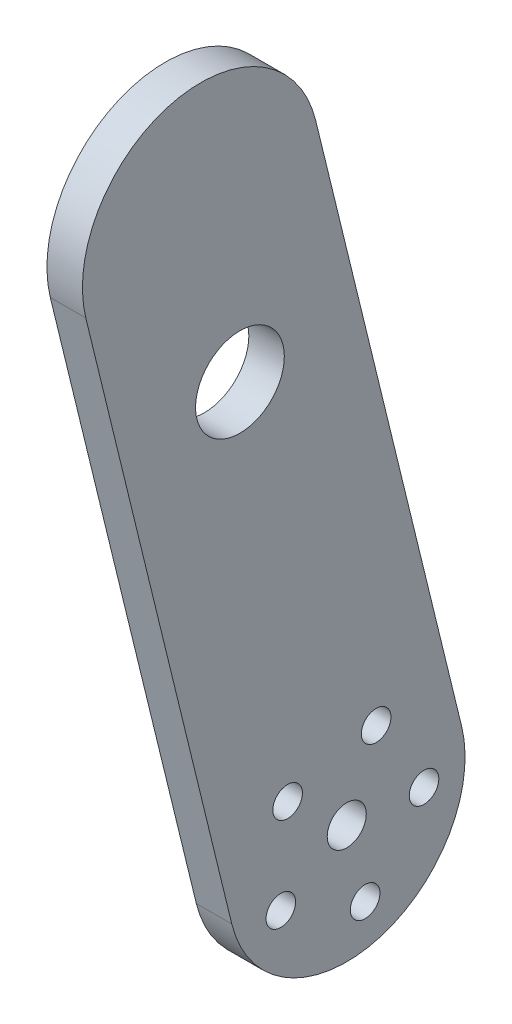
ISO-10303-21;
HEADER;
FILE_DESCRIPTION(('STEP AP214'),'2;1');
FILE_NAME('part.step','',(''),(''),'','','');
FILE_SCHEMA(('AUTOMOTIVE_DESIGN { 1 0 10303 214 1 1 1 1 }'));
ENDSEC;
DATA;
#1=APPLICATION_CONTEXT('core data for automotive mechanical design processes');
#2=APPLICATION_PROTOCOL_DEFINITION('international standard','automotive_design',2000,#1);
#3=PRODUCT_CONTEXT('',#1,'mechanical');
#4=PRODUCT('Part','Part','',(#3));
#5=PRODUCT_RELATED_PRODUCT_CATEGORY('part','',(#4));
#6=PRODUCT_DEFINITION_FORMATION('','',#4);
#7=PRODUCT_DEFINITION_CONTEXT('part definition',#1,'design');
#8=PRODUCT_DEFINITION('design','',#6,#7);
#9=PRODUCT_DEFINITION_SHAPE('','',#8);
#10=(LENGTH_UNIT() NAMED_UNIT(*) SI_UNIT(.MILLI.,.METRE.));
#11=(NAMED_UNIT(*) PLANE_ANGLE_UNIT() SI_UNIT($,.RADIAN.));
#12=(NAMED_UNIT(*) SI_UNIT($,.STERADIAN.) SOLID_ANGLE_UNIT());
#13=UNCERTAINTY_MEASURE_WITH_UNIT(LENGTH_MEASURE(1.E-05),#10,'distance_accuracy_value','');
#14=(GEOMETRIC_REPRESENTATION_CONTEXT(3) GLOBAL_UNCERTAINTY_ASSIGNED_CONTEXT((#13)) GLOBAL_UNIT_ASSIGNED_CONTEXT((#10,
#11,#12)) REPRESENTATION_CONTEXT('',''));
#15=CARTESIAN_POINT('',(0.,0.,0.));
#16=DIRECTION('',(0.,0.,1.));
#17=DIRECTION('',(1.,0.,0.));
#18=AXIS2_PLACEMENT_3D('',#15,#16,#17);
#19=CARTESIAN_POINT('',(0.,15.3999999999998,113.856046119503));
#20=DIRECTION('',(1.,0.,0.));
#21=DIRECTION('',(0.,0.,-1.));
#22=AXIS2_PLACEMENT_3D('',#19,#20,#21);
#23=PLANE('',#22);
#24=CARTESIAN_POINT('',(0.,15.3999999999998,113.856046119503));
#25=DIRECTION('',(-1.,0.,0.));
#26=DIRECTION('',(0.,0.,1.));
#27=AXIS2_PLACEMENT_3D('',#24,#25,#26);
#28=CIRCLE('',#27,1.65);
#29=CARTESIAN_POINT('',(0.,15.3999999999998,115.506046119503));
#30=VERTEX_POINT('',#29);
#31=EDGE_CURVE('E154',#30,#30,#28,.T.);
#32=ORIENTED_EDGE('',*,*,#31,.F.);
#33=EDGE_LOOP('',(#32));
#34=FACE_BOUND('',#33,.T.);
#35=CARTESIAN_POINT('',(0.,19.6343772181252,118.853300323025));
#36=DIRECTION('',(-1.,0.,0.));
#37=DIRECTION('',(0.,0.,1.));
#38=AXIS2_PLACEMENT_3D('',#35,#36,#37);
#39=CIRCLE('',#38,1.24999999999999);
#40=CARTESIAN_POINT('',(0.,19.6343772181252,120.103300323025));
#41=VERTEX_POINT('',#40);
#42=EDGE_CURVE('E148',#41,#41,#39,.T.);
#43=ORIENTED_EDGE('',*,*,#42,.F.);
#44=EDGE_LOOP('',(#43));
#45=FACE_BOUND('',#44,.T.);
#46=CARTESIAN_POINT('',(0.,21.4611656948379,111.373150547853));
#47=DIRECTION('',(-1.,0.,0.));
#48=DIRECTION('',(0.,0.,1.));
#49=AXIS2_PLACEMENT_3D('',#46,#47,#48);
#50=CIRCLE('',#49,1.25);
#51=CARTESIAN_POINT('',(0.,21.4611656948379,112.623150547853));
#52=VERTEX_POINT('',#51);
#53=EDGE_CURVE('E124',#52,#52,#50,.T.);
#54=ORIENTED_EDGE('',*,*,#53,.F.);
#55=EDGE_LOOP('',(#54));
#56=FACE_BOUND('',#55,.T.);
#57=CARTESIAN_POINT('',(0.,15.3999999999998,113.856046119503));
#58=DIRECTION('',(1.,0.,0.));
#59=DIRECTION('',(0.,0.,-1.));
#60=AXIS2_PLACEMENT_3D('',#57,#58,#59);
#61=CIRCLE('',#60,9.99999999999999);
#62=CARTESIAN_POINT('',(0.,13.0275433673224,123.570542994075));
#63=VERTEX_POINT('',#62);
#64=CARTESIAN_POINT('',(0.,17.7724566326776,104.141549244931));
#65=VERTEX_POINT('',#64);
#66=EDGE_CURVE('E102',#63,#65,#61,.T.);
#67=ORIENTED_EDGE('',*,*,#66,.F.);
#68=DIRECTION('',(0.,-0.971449687457173,-0.237245663267763));
#69=VECTOR('',#68,1.);
#70=CARTESIAN_POINT('',(0.,13.0275433673224,123.570542994075));
#71=LINE('',#70,#69);
#72=CARTESIAN_POINT('',(0.,63.5548606030924,135.910231858579));
#73=VERTEX_POINT('',#72);
#74=EDGE_CURVE('E77',#73,#63,#71,.T.);
#75=ORIENTED_EDGE('',*,*,#74,.F.);
#76=CARTESIAN_POINT('',(0.,65.92731723577,126.195734984007));
#77=DIRECTION('',(1.,0.,0.));
#78=DIRECTION('',(0.,0.,-1.));
#79=AXIS2_PLACEMENT_3D('',#76,#77,#78);
#80=CIRCLE('',#79,10.);
#81=CARTESIAN_POINT('',(0.,68.2997738684477,116.481238109435));
#82=VERTEX_POINT('',#81);
#83=EDGE_CURVE('E71',#82,#73,#80,.T.);
#84=ORIENTED_EDGE('',*,*,#83,.F.);
#85=DIRECTION('',(0.,0.971449687457173,0.237245663267763));
#86=VECTOR('',#85,1.);
#87=CARTESIAN_POINT('',(0.,17.7724566326776,104.141549244931));
#88=LINE('',#87,#86);
#89=EDGE_CURVE('E94',#65,#82,#88,.T.);
#90=ORIENTED_EDGE('',*,*,#89,.F.);
#91=EDGE_LOOP('',(#67,#75,#84,#90));
#92=FACE_BOUND('',#91,.T.);
#93=CARTESIAN_POINT('',(0.,52.3596439877639,122.882262675267));
#94=DIRECTION('',(1.,0.,0.));
#95=DIRECTION('',(0.,0.,-1.));
#96=AXIS2_PLACEMENT_3D('',#93,#94,#95);
#97=CIRCLE('',#96,3.75000000000001);
#98=CARTESIAN_POINT('',(0.,52.3596439877639,119.132262675267));
#99=VERTEX_POINT('',#98);
#100=EDGE_CURVE('E116',#99,#99,#97,.T.);
#101=ORIENTED_EDGE('',*,*,#100,.T.);
#102=EDGE_LOOP('',(#101));
#103=FACE_BOUND('',#102,.T.);
#104=CARTESIAN_POINT('',(0.,14.9116291927292,107.324278062185));
#105=DIRECTION('',(-1.,0.,0.));
#106=DIRECTION('',(0.,0.,1.));
#107=AXIS2_PLACEMENT_3D('',#104,#105,#106);
#108=CIRCLE('',#107,1.24999999999999);
#109=CARTESIAN_POINT('',(0.,14.9116291927292,108.574278062185));
#110=VERTEX_POINT('',#109);
#111=EDGE_CURVE('E130',#110,#110,#108,.T.);
#112=ORIENTED_EDGE('',*,*,#111,.F.);
#113=EDGE_LOOP('',(#112));
#114=FACE_BOUND('',#113,.T.);
#115=CARTESIAN_POINT('',(0.,9.03700454715531,112.302087025099));
#116=DIRECTION('',(-1.,0.,0.));
#117=DIRECTION('',(0.,0.,1.));
#118=AXIS2_PLACEMENT_3D('',#115,#116,#117);
#119=CIRCLE('',#118,1.24999999999999);
#120=CARTESIAN_POINT('',(0.,9.03700454715531,113.552087025099));
#121=VERTEX_POINT('',#120);
#122=EDGE_CURVE('E136',#121,#121,#119,.T.);
#123=ORIENTED_EDGE('',*,*,#122,.F.);
#124=EDGE_LOOP('',(#123));
#125=FACE_BOUND('',#124,.T.);
#126=CARTESIAN_POINT('',(0.,11.9558233471515,119.427414639353));
#127=DIRECTION('',(-1.,0.,0.));
#128=DIRECTION('',(0.,0.,1.));
#129=AXIS2_PLACEMENT_3D('',#126,#127,#128);
#130=CIRCLE('',#129,1.24999999999999);
#131=CARTESIAN_POINT('',(0.,11.9558233471515,120.677414639353));
#132=VERTEX_POINT('',#131);
#133=EDGE_CURVE('E142',#132,#132,#130,.T.);
#134=ORIENTED_EDGE('',*,*,#133,.F.);
#135=EDGE_LOOP('',(#134));
#136=FACE_BOUND('',#135,.T.);
#137=ADVANCED_FACE('F37',(#34,#45,#56,#92,#103,#114,#125,#136),#23,.F.);
#138=CARTESIAN_POINT('',(3.,15.3999999999998,113.856046119503));
#139=DIRECTION('',(1.,0.,0.));
#140=DIRECTION('',(0.,0.,-1.));
#141=AXIS2_PLACEMENT_3D('',#138,#139,#140);
#142=PLANE('',#141);
#143=CARTESIAN_POINT('',(3.,15.3999999999998,113.856046119503));
#144=DIRECTION('',(1.,0.,0.));
#145=DIRECTION('',(0.,0.,-1.));
#146=AXIS2_PLACEMENT_3D('',#143,#144,#145);
#147=CIRCLE('',#146,1.65);
#148=CARTESIAN_POINT('',(3.,15.3999999999998,112.206046119503));
#149=VERTEX_POINT('',#148);
#150=EDGE_CURVE('E151',#149,#149,#147,.T.);
#151=ORIENTED_EDGE('',*,*,#150,.F.);
#152=EDGE_LOOP('',(#151));
#153=FACE_BOUND('',#152,.T.);
#154=CARTESIAN_POINT('',(3.,19.6343772181252,118.853300323025));
#155=DIRECTION('',(1.,0.,0.));
#156=DIRECTION('',(0.,0.,-1.));
#157=AXIS2_PLACEMENT_3D('',#154,#155,#156);
#158=CIRCLE('',#157,1.24999999999999);
#159=CARTESIAN_POINT('',(3.,19.6343772181252,117.603300323025));
#160=VERTEX_POINT('',#159);
#161=EDGE_CURVE('E145',#160,#160,#158,.T.);
#162=ORIENTED_EDGE('',*,*,#161,.F.);
#163=EDGE_LOOP('',(#162));
#164=FACE_BOUND('',#163,.T.);
#165=CARTESIAN_POINT('',(3.,11.9558233471515,119.427414639353));
#166=DIRECTION('',(1.,0.,0.));
#167=DIRECTION('',(0.,0.,-1.));
#168=AXIS2_PLACEMENT_3D('',#165,#166,#167);
#169=CIRCLE('',#168,1.24999999999999);
#170=CARTESIAN_POINT('',(3.,11.9558233471515,118.177414639353));
#171=VERTEX_POINT('',#170);
#172=EDGE_CURVE('E139',#171,#171,#169,.T.);
#173=ORIENTED_EDGE('',*,*,#172,.F.);
#174=EDGE_LOOP('',(#173));
#175=FACE_BOUND('',#174,.T.);
#176=CARTESIAN_POINT('',(3.,9.03700454715531,112.302087025099));
#177=DIRECTION('',(1.,0.,0.));
#178=DIRECTION('',(0.,0.,-1.));
#179=AXIS2_PLACEMENT_3D('',#176,#177,#178);
#180=CIRCLE('',#179,1.24999999999999);
#181=CARTESIAN_POINT('',(3.,9.03700454715531,111.052087025099));
#182=VERTEX_POINT('',#181);
#183=EDGE_CURVE('E133',#182,#182,#180,.T.);
#184=ORIENTED_EDGE('',*,*,#183,.F.);
#185=EDGE_LOOP('',(#184));
#186=FACE_BOUND('',#185,.T.);
#187=CARTESIAN_POINT('',(3.,14.9116291927292,107.324278062185));
#188=DIRECTION('',(1.,0.,0.));
#189=DIRECTION('',(0.,0.,-1.));
#190=AXIS2_PLACEMENT_3D('',#187,#188,#189);
#191=CIRCLE('',#190,1.24999999999999);
#192=CARTESIAN_POINT('',(3.,14.9116291927292,106.074278062185));
#193=VERTEX_POINT('',#192);
#194=EDGE_CURVE('E127',#193,#193,#191,.T.);
#195=ORIENTED_EDGE('',*,*,#194,.F.);
#196=EDGE_LOOP('',(#195));
#197=FACE_BOUND('',#196,.T.);
#198=CARTESIAN_POINT('',(3.,21.4611656948379,111.373150547853));
#199=DIRECTION('',(1.,0.,0.));
#200=DIRECTION('',(0.,0.,-1.));
#201=AXIS2_PLACEMENT_3D('',#198,#199,#200);
#202=CIRCLE('',#201,1.25);
#203=CARTESIAN_POINT('',(3.,21.4611656948379,110.123150547853));
#204=VERTEX_POINT('',#203);
#205=EDGE_CURVE('E119',#204,#204,#202,.T.);
#206=ORIENTED_EDGE('',*,*,#205,.F.);
#207=EDGE_LOOP('',(#206));
#208=FACE_BOUND('',#207,.T.);
#209=CARTESIAN_POINT('',(3.,15.3999999999998,113.856046119503));
#210=DIRECTION('',(1.,0.,0.));
#211=DIRECTION('',(0.,0.,-1.));
#212=AXIS2_PLACEMENT_3D('',#209,#210,#211);
#213=CIRCLE('',#212,9.99999999999999);
#214=CARTESIAN_POINT('',(3.,13.0275433673224,123.570542994075));
#215=VERTEX_POINT('',#214);
#216=CARTESIAN_POINT('',(3.,17.7724566326776,104.141549244931));
#217=VERTEX_POINT('',#216);
#218=EDGE_CURVE('E90',#215,#217,#213,.T.);
#219=ORIENTED_EDGE('',*,*,#218,.T.);
#220=DIRECTION('',(0.,0.971449687457173,0.237245663267763));
#221=VECTOR('',#220,1.);
#222=CARTESIAN_POINT('',(3.,17.7724566326776,104.141549244931));
#223=LINE('',#222,#221);
#224=CARTESIAN_POINT('',(3.,68.2997738684477,116.481238109435));
#225=VERTEX_POINT('',#224);
#226=EDGE_CURVE('E84',#217,#225,#223,.T.);
#227=ORIENTED_EDGE('',*,*,#226,.T.);
#228=CARTESIAN_POINT('',(3.,65.92731723577,126.195734984007));
#229=DIRECTION('',(1.,0.,0.));
#230=DIRECTION('',(0.,0.,-1.));
#231=AXIS2_PLACEMENT_3D('',#228,#229,#230);
#232=CIRCLE('',#231,10.);
#233=CARTESIAN_POINT('',(3.,63.5548606030924,135.910231858579));
#234=VERTEX_POINT('',#233);
#235=EDGE_CURVE('E88',#225,#234,#232,.T.);
#236=ORIENTED_EDGE('',*,*,#235,.T.);
#237=DIRECTION('',(0.,-0.971449687457173,-0.237245663267763));
#238=VECTOR('',#237,1.);
#239=CARTESIAN_POINT('',(3.,13.0275433673224,123.570542994075));
#240=LINE('',#239,#238);
#241=EDGE_CURVE('E54',#234,#215,#240,.T.);
#242=ORIENTED_EDGE('',*,*,#241,.T.);
#243=EDGE_LOOP('',(#219,#227,#236,#242));
#244=FACE_BOUND('',#243,.T.);
#245=CARTESIAN_POINT('',(3.,52.3596439877639,122.882262675267));
#246=DIRECTION('',(1.,0.,0.));
#247=DIRECTION('',(0.,0.,-1.));
#248=AXIS2_PLACEMENT_3D('',#245,#246,#247);
#249=CIRCLE('',#248,3.75000000000001);
#250=CARTESIAN_POINT('',(3.,52.3596439877639,119.132262675267));
#251=VERTEX_POINT('',#250);
#252=EDGE_CURVE('E105',#251,#251,#249,.T.);
#253=ORIENTED_EDGE('',*,*,#252,.F.);
#254=EDGE_LOOP('',(#253));
#255=FACE_BOUND('',#254,.T.);
#256=ADVANCED_FACE('F85',(#153,#164,#175,#186,#197,#208,#244,#255),#142,.T.);
#257=CARTESIAN_POINT('',(3.,15.3999999999998,113.856046119503));
#258=DIRECTION('',(-1.,0.,0.));
#259=DIRECTION('',(0.,0.,1.));
#260=AXIS2_PLACEMENT_3D('',#257,#258,#259);
#261=CYLINDRICAL_SURFACE('',#260,9.99999999999999);
#262=ORIENTED_EDGE('',*,*,#66,.T.);
#263=DIRECTION('',(-1.,0.,0.));
#264=VECTOR('',#263,1.);
#265=CARTESIAN_POINT('',(3.,17.7724566326776,104.141549244931));
#266=LINE('',#265,#264);
#267=EDGE_CURVE('E11',#217,#65,#266,.T.);
#268=ORIENTED_EDGE('',*,*,#267,.F.);
#269=ORIENTED_EDGE('',*,*,#218,.F.);
#270=DIRECTION('',(-1.,0.,0.));
#271=VECTOR('',#270,1.);
#272=CARTESIAN_POINT('',(3.,13.0275433673224,123.570542994075));
#273=LINE('',#272,#271);
#274=EDGE_CURVE('E98',#215,#63,#273,.T.);
#275=ORIENTED_EDGE('',*,*,#274,.T.);
#276=EDGE_LOOP('',(#262,#268,#269,#275));
#277=FACE_BOUND('',#276,.T.);
#278=ADVANCED_FACE('F39',(#277),#261,.T.);
#279=CARTESIAN_POINT('',(3.,17.7724566326776,104.141549244931));
#280=DIRECTION('',(0.,-0.237245663267763,0.971449687457173));
#281=DIRECTION('',(0.,-0.971449687457173,-0.237245663267763));
#282=AXIS2_PLACEMENT_3D('',#279,#280,#281);
#283=PLANE('',#282);
#284=ORIENTED_EDGE('',*,*,#89,.T.);
#285=DIRECTION('',(-1.,0.,0.));
#286=VECTOR('',#285,1.);
#287=CARTESIAN_POINT('',(3.,68.2997738684477,116.481238109435));
#288=LINE('',#287,#286);
#289=EDGE_CURVE('E46',#225,#82,#288,.T.);
#290=ORIENTED_EDGE('',*,*,#289,.F.);
#291=ORIENTED_EDGE('',*,*,#226,.F.);
#292=ORIENTED_EDGE('',*,*,#267,.T.);
#293=EDGE_LOOP('',(#284,#290,#291,#292));
#294=FACE_BOUND('',#293,.T.);
#295=ADVANCED_FACE('F93',(#294),#283,.F.);
#296=CARTESIAN_POINT('',(3.,65.92731723577,126.195734984007));
#297=DIRECTION('',(-1.,0.,0.));
#298=DIRECTION('',(0.,0.,1.));
#299=AXIS2_PLACEMENT_3D('',#296,#297,#298);
#300=CYLINDRICAL_SURFACE('',#299,10.);
#301=ORIENTED_EDGE('',*,*,#83,.T.);
#302=DIRECTION('',(-1.,0.,0.));
#303=VECTOR('',#302,1.);
#304=CARTESIAN_POINT('',(3.,63.5548606030924,135.910231858579));
#305=LINE('',#304,#303);
#306=EDGE_CURVE('E95',#234,#73,#305,.T.);
#307=ORIENTED_EDGE('',*,*,#306,.F.);
#308=ORIENTED_EDGE('',*,*,#235,.F.);
#309=ORIENTED_EDGE('',*,*,#289,.T.);
#310=EDGE_LOOP('',(#301,#307,#308,#309));
#311=FACE_BOUND('',#310,.T.);
#312=ADVANCED_FACE('F96',(#311),#300,.T.);
#313=CARTESIAN_POINT('',(3.,13.0275433673224,123.570542994075));
#314=DIRECTION('',(0.,0.237245663267763,-0.971449687457173));
#315=DIRECTION('',(0.,0.971449687457173,0.237245663267763));
#316=AXIS2_PLACEMENT_3D('',#313,#314,#315);
#317=PLANE('',#316);
#318=ORIENTED_EDGE('',*,*,#74,.T.);
#319=ORIENTED_EDGE('',*,*,#274,.F.);
#320=ORIENTED_EDGE('',*,*,#241,.F.);
#321=ORIENTED_EDGE('',*,*,#306,.T.);
#322=EDGE_LOOP('',(#318,#319,#320,#321));
#323=FACE_BOUND('',#322,.T.);
#324=ADVANCED_FACE('F110',(#323),#317,.F.);
#325=CARTESIAN_POINT('',(3.,52.3596439877639,122.882262675267));
#326=DIRECTION('',(-1.,0.,0.));
#327=DIRECTION('',(0.,0.,1.));
#328=AXIS2_PLACEMENT_3D('',#325,#326,#327);
#329=CYLINDRICAL_SURFACE('',#328,3.75000000000001);
#330=ORIENTED_EDGE('',*,*,#252,.T.);
#331=EDGE_LOOP('',(#330));
#332=FACE_BOUND('',#331,.T.);
#333=ORIENTED_EDGE('',*,*,#100,.F.);
#334=EDGE_LOOP('',(#333));
#335=FACE_BOUND('',#334,.T.);
#336=ADVANCED_FACE('F172',(#332,#335),#329,.F.);
#337=CARTESIAN_POINT('',(0.,21.4611656948379,111.373150547853));
#338=DIRECTION('',(-1.,0.,0.));
#339=DIRECTION('',(0.,0.,1.));
#340=AXIS2_PLACEMENT_3D('',#337,#338,#339);
#341=CYLINDRICAL_SURFACE('',#340,1.25);
#342=ORIENTED_EDGE('',*,*,#53,.T.);
#343=EDGE_LOOP('',(#342));
#344=FACE_BOUND('',#343,.T.);
#345=ORIENTED_EDGE('',*,*,#205,.T.);
#346=EDGE_LOOP('',(#345));
#347=FACE_BOUND('',#346,.T.);
#348=ADVANCED_FACE('F168',(#344,#347),#341,.F.);
#349=CARTESIAN_POINT('',(0.,14.9116291927292,107.324278062185));
#350=DIRECTION('',(-1.,0.,0.));
#351=DIRECTION('',(0.,0.,1.));
#352=AXIS2_PLACEMENT_3D('',#349,#350,#351);
#353=CYLINDRICAL_SURFACE('',#352,1.24999999999999);
#354=ORIENTED_EDGE('',*,*,#111,.T.);
#355=EDGE_LOOP('',(#354));
#356=FACE_BOUND('',#355,.T.);
#357=ORIENTED_EDGE('',*,*,#194,.T.);
#358=EDGE_LOOP('',(#357));
#359=FACE_BOUND('',#358,.T.);
#360=ADVANCED_FACE('F171',(#356,#359),#353,.F.);
#361=CARTESIAN_POINT('',(0.,9.03700454715531,112.302087025099));
#362=DIRECTION('',(-1.,0.,0.));
#363=DIRECTION('',(0.,0.,1.));
#364=AXIS2_PLACEMENT_3D('',#361,#362,#363);
#365=CYLINDRICAL_SURFACE('',#364,1.24999999999999);
#366=ORIENTED_EDGE('',*,*,#122,.T.);
#367=EDGE_LOOP('',(#366));
#368=FACE_BOUND('',#367,.T.);
#369=ORIENTED_EDGE('',*,*,#183,.T.);
#370=EDGE_LOOP('',(#369));
#371=FACE_BOUND('',#370,.T.);
#372=ADVANCED_FACE('F221',(#368,#371),#365,.F.);
#373=CARTESIAN_POINT('',(0.,11.9558233471515,119.427414639353));
#374=DIRECTION('',(-1.,0.,0.));
#375=DIRECTION('',(0.,0.,1.));
#376=AXIS2_PLACEMENT_3D('',#373,#374,#375);
#377=CYLINDRICAL_SURFACE('',#376,1.24999999999999);
#378=ORIENTED_EDGE('',*,*,#133,.T.);
#379=EDGE_LOOP('',(#378));
#380=FACE_BOUND('',#379,.T.);
#381=ORIENTED_EDGE('',*,*,#172,.T.);
#382=EDGE_LOOP('',(#381));
#383=FACE_BOUND('',#382,.T.);
#384=ADVANCED_FACE('F230',(#380,#383),#377,.F.);
#385=CARTESIAN_POINT('',(0.,19.6343772181252,118.853300323025));
#386=DIRECTION('',(-1.,0.,0.));
#387=DIRECTION('',(0.,0.,1.));
#388=AXIS2_PLACEMENT_3D('',#385,#386,#387);
#389=CYLINDRICAL_SURFACE('',#388,1.24999999999999);
#390=ORIENTED_EDGE('',*,*,#42,.T.);
#391=EDGE_LOOP('',(#390));
#392=FACE_BOUND('',#391,.T.);
#393=ORIENTED_EDGE('',*,*,#161,.T.);
#394=EDGE_LOOP('',(#393));
#395=FACE_BOUND('',#394,.T.);
#396=ADVANCED_FACE('F238',(#392,#395),#389,.F.);
#397=CARTESIAN_POINT('',(0.,15.3999999999998,113.856046119503));
#398=DIRECTION('',(-1.,0.,0.));
#399=DIRECTION('',(0.,0.,1.));
#400=AXIS2_PLACEMENT_3D('',#397,#398,#399);
#401=CYLINDRICAL_SURFACE('',#400,1.65);
#402=ORIENTED_EDGE('',*,*,#31,.T.);
#403=EDGE_LOOP('',(#402));
#404=FACE_BOUND('',#403,.T.);
#405=ORIENTED_EDGE('',*,*,#150,.T.);
#406=EDGE_LOOP('',(#405));
#407=FACE_BOUND('',#406,.T.);
#408=ADVANCED_FACE('F158',(#404,#407),#401,.F.);
#409=CLOSED_SHELL('',(#137,#256,#278,#295,#312,#324,#336,#348,#360,#372,#384,#396,#408));
#410=MANIFOLD_SOLID_BREP('B2',#409);
#411=ADVANCED_BREP_SHAPE_REPRESENTATION('',(#18,#410),#14);
#412=SHAPE_DEFINITION_REPRESENTATION(#9,#411);
ENDSEC;
END-ISO-10303-21;
